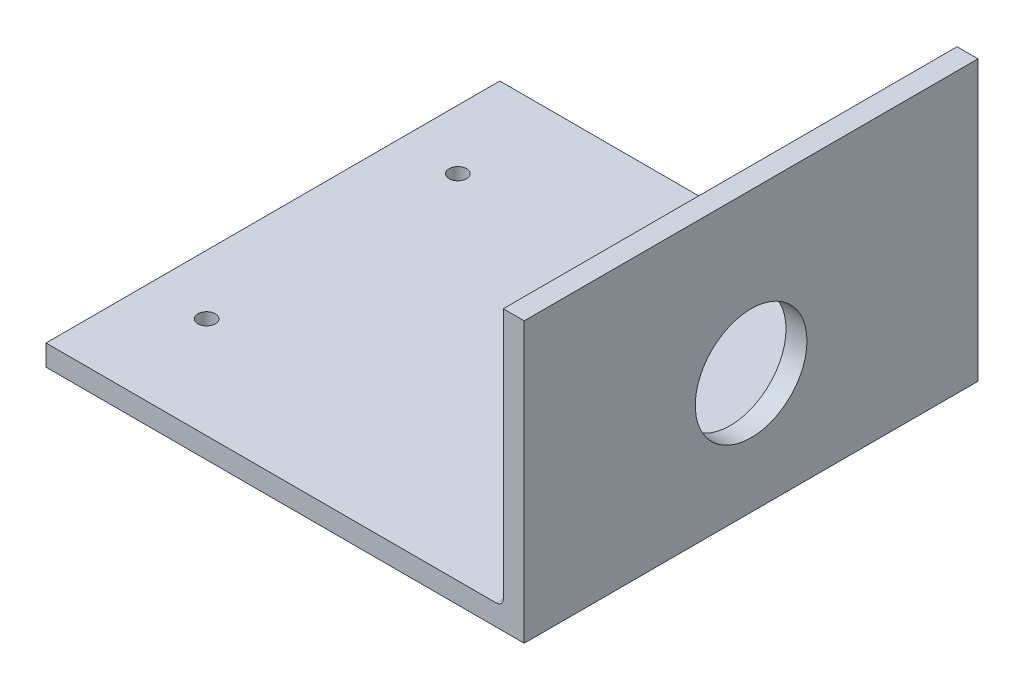
ISO-10303-21;
HEADER;
FILE_DESCRIPTION(('STEP AP214'),'2;1');
FILE_NAME('part.step','',(''),(''),'','','');
FILE_SCHEMA(('AUTOMOTIVE_DESIGN { 1 0 10303 214 1 1 1 1 }'));
ENDSEC;
DATA;
#1=APPLICATION_CONTEXT('core data for automotive mechanical design processes');
#2=APPLICATION_PROTOCOL_DEFINITION('international standard','automotive_design',2000,#1);
#3=PRODUCT_CONTEXT('',#1,'mechanical');
#4=PRODUCT('Part','Part','',(#3));
#5=PRODUCT_RELATED_PRODUCT_CATEGORY('part','',(#4));
#6=PRODUCT_DEFINITION_FORMATION('','',#4);
#7=PRODUCT_DEFINITION_CONTEXT('part definition',#1,'design');
#8=PRODUCT_DEFINITION('design','',#6,#7);
#9=PRODUCT_DEFINITION_SHAPE('','',#8);
#10=(LENGTH_UNIT() NAMED_UNIT(*) SI_UNIT(.MILLI.,.METRE.));
#11=(NAMED_UNIT(*) PLANE_ANGLE_UNIT() SI_UNIT($,.RADIAN.));
#12=(NAMED_UNIT(*) SI_UNIT($,.STERADIAN.) SOLID_ANGLE_UNIT());
#13=UNCERTAINTY_MEASURE_WITH_UNIT(LENGTH_MEASURE(1.E-05),#10,'distance_accuracy_value','');
#14=(GEOMETRIC_REPRESENTATION_CONTEXT(3) GLOBAL_UNCERTAINTY_ASSIGNED_CONTEXT((#13)) GLOBAL_UNIT_ASSIGNED_CONTEXT((#10,
#11,#12)) REPRESENTATION_CONTEXT('',''));
#15=CARTESIAN_POINT('',(0.,0.,0.));
#16=DIRECTION('',(0.,0.,1.));
#17=DIRECTION('',(1.,0.,0.));
#18=AXIS2_PLACEMENT_3D('',#15,#16,#17);
#19=CARTESIAN_POINT('',(0.,860.629465365196,0.));
#20=DIRECTION('',(0.,-1.,0.));
#21=DIRECTION('',(0.,0.,-1.));
#22=AXIS2_PLACEMENT_3D('',#19,#20,#21);
#23=PLANE('',#22);
#24=CARTESIAN_POINT('',(709.231990877992,860.629465365196,1291.3328662841));
#25=DIRECTION('',(0.,-1.,0.));
#26=DIRECTION('',(0.,0.,-1.));
#27=AXIS2_PLACEMENT_3D('',#24,#25,#26);
#28=CIRCLE('',#27,1.24999999999997);
#29=CARTESIAN_POINT('',(709.231990877992,860.629465365196,1290.0828662841));
#30=VERTEX_POINT('',#29);
#31=EDGE_CURVE('E134',#30,#30,#28,.T.);
#32=ORIENTED_EDGE('',*,*,#31,.F.);
#33=EDGE_LOOP('',(#32));
#34=FACE_BOUND('',#33,.T.);
#35=CARTESIAN_POINT('',(661.231990877992,860.629465365196,1327.3328662841));
#36=DIRECTION('',(0.,-1.,0.));
#37=DIRECTION('',(0.,0.,-1.));
#38=AXIS2_PLACEMENT_3D('',#35,#36,#37);
#39=CIRCLE('',#38,1.24999999999997);
#40=CARTESIAN_POINT('',(661.231990877992,860.629465365196,1326.0828662841));
#41=VERTEX_POINT('',#40);
#42=EDGE_CURVE('E146',#41,#41,#39,.T.);
#43=ORIENTED_EDGE('',*,*,#42,.F.);
#44=EDGE_LOOP('',(#43));
#45=FACE_BOUND('',#44,.T.);
#46=DIRECTION('',(1.,0.,0.));
#47=VECTOR('',#46,1.);
#48=CARTESIAN_POINT('',(652.731990877992,860.629465365196,1276.8328662841));
#49=LINE('',#48,#47);
#50=CARTESIAN_POINT('',(652.731990877992,860.629465365196,1276.8328662841));
#51=VERTEX_POINT('',#50);
#52=CARTESIAN_POINT('',(721.231990877992,860.629465365196,1276.8328662841));
#53=VERTEX_POINT('',#52);
#54=EDGE_CURVE('E157',#51,#53,#49,.T.);
#55=ORIENTED_EDGE('',*,*,#54,.T.);
#56=DIRECTION('',(0.,0.,-1.));
#57=VECTOR('',#56,1.);
#58=CARTESIAN_POINT('',(721.231990877992,860.629465365196,1381.98569930993));
#59=LINE('',#58,#57);
#60=CARTESIAN_POINT('',(721.231990877992,860.629465365196,1341.8328662841));
#61=VERTEX_POINT('',#60);
#62=EDGE_CURVE('E122',#61,#53,#59,.T.);
#63=ORIENTED_EDGE('',*,*,#62,.F.);
#64=DIRECTION('',(-1.,0.,0.));
#65=VECTOR('',#64,1.);
#66=CARTESIAN_POINT('',(652.731990877992,860.629465365196,1341.8328662841));
#67=LINE('',#66,#65);
#68=CARTESIAN_POINT('',(652.731990877992,860.629465365196,1341.8328662841));
#69=VERTEX_POINT('',#68);
#70=EDGE_CURVE('E152',#61,#69,#67,.T.);
#71=ORIENTED_EDGE('',*,*,#70,.T.);
#72=DIRECTION('',(0.,0.,-1.));
#73=VECTOR('',#72,1.);
#74=CARTESIAN_POINT('',(652.731990877992,860.629465365196,1341.8328662841));
#75=LINE('',#74,#73);
#76=EDGE_CURVE('E154',#69,#51,#75,.T.);
#77=ORIENTED_EDGE('',*,*,#76,.T.);
#78=EDGE_LOOP('',(#55,#63,#71,#77));
#79=FACE_BOUND('',#78,.T.);
#80=CARTESIAN_POINT('',(661.231990877992,860.629465365196,1291.3328662841));
#81=DIRECTION('',(0.,-1.,0.));
#82=DIRECTION('',(0.,0.,-1.));
#83=AXIS2_PLACEMENT_3D('',#80,#81,#82);
#84=CIRCLE('',#83,1.24999999999997);
#85=CARTESIAN_POINT('',(661.231990877992,860.629465365196,1290.0828662841));
#86=VERTEX_POINT('',#85);
#87=EDGE_CURVE('E140',#86,#86,#84,.T.);
#88=ORIENTED_EDGE('',*,*,#87,.F.);
#89=EDGE_LOOP('',(#88));
#90=FACE_BOUND('',#89,.T.);
#91=CARTESIAN_POINT('',(709.231990877992,860.629465365196,1327.3328662841));
#92=DIRECTION('',(0.,-1.,0.));
#93=DIRECTION('',(0.,0.,-1.));
#94=AXIS2_PLACEMENT_3D('',#91,#92,#93);
#95=CIRCLE('',#94,1.24999999999997);
#96=CARTESIAN_POINT('',(709.231990877992,860.629465365196,1326.0828662841));
#97=VERTEX_POINT('',#96);
#98=EDGE_CURVE('E126',#97,#97,#95,.T.);
#99=ORIENTED_EDGE('',*,*,#98,.F.);
#100=EDGE_LOOP('',(#99));
#101=FACE_BOUND('',#100,.T.);
#102=ADVANCED_FACE('F42',(#34,#45,#79,#90,#101),#23,.T.);
#103=CARTESIAN_POINT('',(0.,863.629465365196,0.));
#104=DIRECTION('',(0.,-1.,0.));
#105=DIRECTION('',(0.,0.,-1.));
#106=AXIS2_PLACEMENT_3D('',#103,#104,#105);
#107=PLANE('',#106);
#108=DIRECTION('',(-1.,0.,0.));
#109=VECTOR('',#108,1.);
#110=CARTESIAN_POINT('',(652.731990877992,863.629465365196,1341.8328662841));
#111=LINE('',#110,#109);
#112=CARTESIAN_POINT('',(717.231990877992,863.629465365196,1341.8328662841));
#113=VERTEX_POINT('',#112);
#114=CARTESIAN_POINT('',(652.731990877992,863.629465365196,1341.8328662841));
#115=VERTEX_POINT('',#114);
#116=EDGE_CURVE('E149',#113,#115,#111,.T.);
#117=ORIENTED_EDGE('',*,*,#116,.F.);
#118=DIRECTION('',(0.,0.,-1.));
#119=VECTOR('',#118,1.);
#120=CARTESIAN_POINT('',(717.231990877992,863.629465365196,0.));
#121=LINE('',#120,#119);
#122=CARTESIAN_POINT('',(717.231990877992,863.629465365196,1276.8328662841));
#123=VERTEX_POINT('',#122);
#124=EDGE_CURVE('E169',#113,#123,#121,.T.);
#125=ORIENTED_EDGE('',*,*,#124,.T.);
#126=DIRECTION('',(1.,0.,0.));
#127=VECTOR('',#126,1.);
#128=CARTESIAN_POINT('',(652.731990877992,863.629465365196,1276.8328662841));
#129=LINE('',#128,#127);
#130=CARTESIAN_POINT('',(652.731990877992,863.629465365196,1276.8328662841));
#131=VERTEX_POINT('',#130);
#132=EDGE_CURVE('E155',#131,#123,#129,.T.);
#133=ORIENTED_EDGE('',*,*,#132,.F.);
#134=DIRECTION('',(0.,0.,-1.));
#135=VECTOR('',#134,1.);
#136=CARTESIAN_POINT('',(652.731990877992,863.629465365196,1341.8328662841));
#137=LINE('',#136,#135);
#138=EDGE_CURVE('E161',#115,#131,#137,.T.);
#139=ORIENTED_EDGE('',*,*,#138,.F.);
#140=EDGE_LOOP('',(#117,#125,#133,#139));
#141=FACE_BOUND('',#140,.T.);
#142=CARTESIAN_POINT('',(661.231990877992,863.629465365196,1327.3328662841));
#143=DIRECTION('',(0.,-1.,0.));
#144=DIRECTION('',(0.,0.,-1.));
#145=AXIS2_PLACEMENT_3D('',#142,#143,#144);
#146=CIRCLE('',#145,1.24999999999997);
#147=CARTESIAN_POINT('',(661.231990877992,863.629465365196,1326.0828662841));
#148=VERTEX_POINT('',#147);
#149=EDGE_CURVE('E143',#148,#148,#146,.T.);
#150=ORIENTED_EDGE('',*,*,#149,.T.);
#151=EDGE_LOOP('',(#150));
#152=FACE_BOUND('',#151,.T.);
#153=CARTESIAN_POINT('',(661.231990877992,863.629465365196,1291.3328662841));
#154=DIRECTION('',(0.,-1.,0.));
#155=DIRECTION('',(0.,0.,-1.));
#156=AXIS2_PLACEMENT_3D('',#153,#154,#155);
#157=CIRCLE('',#156,1.24999999999997);
#158=CARTESIAN_POINT('',(661.231990877992,863.629465365196,1290.0828662841));
#159=VERTEX_POINT('',#158);
#160=EDGE_CURVE('E137',#159,#159,#157,.T.);
#161=ORIENTED_EDGE('',*,*,#160,.T.);
#162=EDGE_LOOP('',(#161));
#163=FACE_BOUND('',#162,.T.);
#164=CARTESIAN_POINT('',(709.231990877992,863.629465365196,1291.3328662841));
#165=DIRECTION('',(0.,-1.,0.));
#166=DIRECTION('',(0.,0.,-1.));
#167=AXIS2_PLACEMENT_3D('',#164,#165,#166);
#168=CIRCLE('',#167,1.24999999999997);
#169=CARTESIAN_POINT('',(709.231990877992,863.629465365196,1290.0828662841));
#170=VERTEX_POINT('',#169);
#171=EDGE_CURVE('E129',#170,#170,#168,.T.);
#172=ORIENTED_EDGE('',*,*,#171,.T.);
#173=EDGE_LOOP('',(#172));
#174=FACE_BOUND('',#173,.T.);
#175=CARTESIAN_POINT('',(709.231990877992,863.629465365196,1327.3328662841));
#176=DIRECTION('',(0.,-1.,0.));
#177=DIRECTION('',(0.,0.,-1.));
#178=AXIS2_PLACEMENT_3D('',#175,#176,#177);
#179=CIRCLE('',#178,1.24999999999997);
#180=CARTESIAN_POINT('',(709.231990877992,863.629465365196,1326.0828662841));
#181=VERTEX_POINT('',#180);
#182=EDGE_CURVE('E130',#181,#181,#179,.T.);
#183=ORIENTED_EDGE('',*,*,#182,.T.);
#184=EDGE_LOOP('',(#183));
#185=FACE_BOUND('',#184,.T.);
#186=ADVANCED_FACE('F176',(#141,#152,#163,#174,#185),#107,.F.);
#187=CARTESIAN_POINT('',(652.731990877992,860.629465365196,1341.8328662841));
#188=DIRECTION('',(0.,0.,-1.));
#189=DIRECTION('',(-1.,0.,0.));
#190=AXIS2_PLACEMENT_3D('',#187,#188,#189);
#191=PLANE('',#190);
#192=DIRECTION('',(0.,-1.,0.));
#193=VECTOR('',#192,1.);
#194=CARTESIAN_POINT('',(718.231990877992,863.629465365196,1341.8328662841));
#195=LINE('',#194,#193);
#196=CARTESIAN_POINT('',(718.231990877992,900.629465365196,1341.8328662841));
#197=VERTEX_POINT('',#196);
#198=CARTESIAN_POINT('',(718.231990877992,864.629465365196,1341.8328662841));
#199=VERTEX_POINT('',#198);
#200=EDGE_CURVE('E110',#197,#199,#195,.T.);
#201=ORIENTED_EDGE('',*,*,#200,.T.);
#202=CARTESIAN_POINT('',(717.231990877992,864.629465365196,1341.8328662841));
#203=DIRECTION('',(0.,0.,-1.));
#204=DIRECTION('',(-1.,0.,0.));
#205=AXIS2_PLACEMENT_3D('',#202,#203,#204);
#206=CIRCLE('',#205,1.);
#207=EDGE_CURVE('E11',#199,#113,#206,.T.);
#208=ORIENTED_EDGE('',*,*,#207,.T.);
#209=ORIENTED_EDGE('',*,*,#116,.T.);
#210=DIRECTION('',(0.,1.,0.));
#211=VECTOR('',#210,1.);
#212=CARTESIAN_POINT('',(652.731990877992,860.629465365196,1341.8328662841));
#213=LINE('',#212,#211);
#214=EDGE_CURVE('E166',#69,#115,#213,.T.);
#215=ORIENTED_EDGE('',*,*,#214,.F.);
#216=ORIENTED_EDGE('',*,*,#70,.F.);
#217=DIRECTION('',(0.,1.,0.));
#218=VECTOR('',#217,1.);
#219=CARTESIAN_POINT('',(721.231990877992,900.629465365196,1341.8328662841));
#220=LINE('',#219,#218);
#221=CARTESIAN_POINT('',(721.231990877992,900.629465365196,1341.8328662841));
#222=VERTEX_POINT('',#221);
#223=EDGE_CURVE('E133',#61,#222,#220,.T.);
#224=ORIENTED_EDGE('',*,*,#223,.T.);
#225=DIRECTION('',(-1.,0.,0.));
#226=VECTOR('',#225,1.);
#227=CARTESIAN_POINT('',(718.231990877992,900.629465365196,1341.8328662841));
#228=LINE('',#227,#226);
#229=EDGE_CURVE('E297',#222,#197,#228,.T.);
#230=ORIENTED_EDGE('',*,*,#229,.T.);
#231=EDGE_LOOP('',(#201,#208,#209,#215,#216,#224,#230));
#232=FACE_BOUND('',#231,.T.);
#233=ADVANCED_FACE('F188',(#232),#191,.F.);
#234=CARTESIAN_POINT('',(652.731990877992,860.629465365196,1341.8328662841));
#235=DIRECTION('',(1.,0.,0.));
#236=DIRECTION('',(0.,0.,-1.));
#237=AXIS2_PLACEMENT_3D('',#234,#235,#236);
#238=PLANE('',#237);
#239=ORIENTED_EDGE('',*,*,#138,.T.);
#240=DIRECTION('',(0.,1.,0.));
#241=VECTOR('',#240,1.);
#242=CARTESIAN_POINT('',(652.731990877992,860.629465365196,1276.8328662841));
#243=LINE('',#242,#241);
#244=EDGE_CURVE('E159',#51,#131,#243,.T.);
#245=ORIENTED_EDGE('',*,*,#244,.F.);
#246=ORIENTED_EDGE('',*,*,#76,.F.);
#247=ORIENTED_EDGE('',*,*,#214,.T.);
#248=EDGE_LOOP('',(#239,#245,#246,#247));
#249=FACE_BOUND('',#248,.T.);
#250=ADVANCED_FACE('F185',(#249),#238,.F.);
#251=CARTESIAN_POINT('',(652.731990877992,860.629465365196,1276.8328662841));
#252=DIRECTION('',(0.,0.,1.));
#253=DIRECTION('',(1.,0.,0.));
#254=AXIS2_PLACEMENT_3D('',#251,#252,#253);
#255=PLANE('',#254);
#256=ORIENTED_EDGE('',*,*,#132,.T.);
#257=CARTESIAN_POINT('',(717.231990877992,864.629465365196,1276.8328662841));
#258=DIRECTION('',(0.,0.,1.));
#259=DIRECTION('',(1.,0.,0.));
#260=AXIS2_PLACEMENT_3D('',#257,#258,#259);
#261=CIRCLE('',#260,1.);
#262=CARTESIAN_POINT('',(718.231990877992,864.629465365196,1276.8328662841));
#263=VERTEX_POINT('',#262);
#264=EDGE_CURVE('E50',#123,#263,#261,.T.);
#265=ORIENTED_EDGE('',*,*,#264,.T.);
#266=DIRECTION('',(0.,1.,0.));
#267=VECTOR('',#266,1.);
#268=CARTESIAN_POINT('',(718.231990877992,863.629465365196,1276.8328662841));
#269=LINE('',#268,#267);
#270=CARTESIAN_POINT('',(718.231990877992,900.629465365196,1276.8328662841));
#271=VERTEX_POINT('',#270);
#272=EDGE_CURVE('E98',#263,#271,#269,.T.);
#273=ORIENTED_EDGE('',*,*,#272,.T.);
#274=DIRECTION('',(1.,0.,0.));
#275=VECTOR('',#274,1.);
#276=CARTESIAN_POINT('',(718.231990877992,900.629465365196,1276.8328662841));
#277=LINE('',#276,#275);
#278=CARTESIAN_POINT('',(721.231990877992,900.629465365196,1276.8328662841));
#279=VERTEX_POINT('',#278);
#280=EDGE_CURVE('E103',#271,#279,#277,.T.);
#281=ORIENTED_EDGE('',*,*,#280,.T.);
#282=DIRECTION('',(0.,-1.,0.));
#283=VECTOR('',#282,1.);
#284=CARTESIAN_POINT('',(721.231990877992,900.629465365196,1276.8328662841));
#285=LINE('',#284,#283);
#286=EDGE_CURVE('E114',#279,#53,#285,.T.);
#287=ORIENTED_EDGE('',*,*,#286,.T.);
#288=ORIENTED_EDGE('',*,*,#54,.F.);
#289=ORIENTED_EDGE('',*,*,#244,.T.);
#290=EDGE_LOOP('',(#256,#265,#273,#281,#287,#288,#289));
#291=FACE_BOUND('',#290,.T.);
#292=ADVANCED_FACE('F100',(#291),#255,.F.);
#293=CARTESIAN_POINT('',(661.231990877992,860.629465365196,1327.3328662841));
#294=DIRECTION('',(0.,1.,0.));
#295=DIRECTION('',(0.,0.,1.));
#296=AXIS2_PLACEMENT_3D('',#293,#294,#295);
#297=CYLINDRICAL_SURFACE('',#296,1.24999999999997);
#298=ORIENTED_EDGE('',*,*,#149,.F.);
#299=EDGE_LOOP('',(#298));
#300=FACE_BOUND('',#299,.T.);
#301=ORIENTED_EDGE('',*,*,#42,.T.);
#302=EDGE_LOOP('',(#301));
#303=FACE_BOUND('',#302,.T.);
#304=ADVANCED_FACE('F210',(#300,#303),#297,.F.);
#305=CARTESIAN_POINT('',(661.231990877992,860.629465365196,1291.3328662841));
#306=DIRECTION('',(0.,1.,0.));
#307=DIRECTION('',(0.,0.,1.));
#308=AXIS2_PLACEMENT_3D('',#305,#306,#307);
#309=CYLINDRICAL_SURFACE('',#308,1.24999999999997);
#310=ORIENTED_EDGE('',*,*,#160,.F.);
#311=EDGE_LOOP('',(#310));
#312=FACE_BOUND('',#311,.T.);
#313=ORIENTED_EDGE('',*,*,#87,.T.);
#314=EDGE_LOOP('',(#313));
#315=FACE_BOUND('',#314,.T.);
#316=ADVANCED_FACE('F268',(#312,#315),#309,.F.);
#317=CARTESIAN_POINT('',(709.231990877992,860.629465365196,1291.3328662841));
#318=DIRECTION('',(0.,1.,0.));
#319=DIRECTION('',(0.,0.,1.));
#320=AXIS2_PLACEMENT_3D('',#317,#318,#319);
#321=CYLINDRICAL_SURFACE('',#320,1.24999999999997);
#322=ORIENTED_EDGE('',*,*,#171,.F.);
#323=EDGE_LOOP('',(#322));
#324=FACE_BOUND('',#323,.T.);
#325=ORIENTED_EDGE('',*,*,#31,.T.);
#326=EDGE_LOOP('',(#325));
#327=FACE_BOUND('',#326,.T.);
#328=ADVANCED_FACE('F265',(#324,#327),#321,.F.);
#329=CARTESIAN_POINT('',(709.231990877992,860.629465365196,1327.3328662841));
#330=DIRECTION('',(0.,1.,0.));
#331=DIRECTION('',(0.,0.,1.));
#332=AXIS2_PLACEMENT_3D('',#329,#330,#331);
#333=CYLINDRICAL_SURFACE('',#332,1.24999999999997);
#334=ORIENTED_EDGE('',*,*,#182,.F.);
#335=EDGE_LOOP('',(#334));
#336=FACE_BOUND('',#335,.T.);
#337=ORIENTED_EDGE('',*,*,#98,.T.);
#338=EDGE_LOOP('',(#337));
#339=FACE_BOUND('',#338,.T.);
#340=ADVANCED_FACE('F255',(#336,#339),#333,.F.);
#341=CARTESIAN_POINT('',(721.231990877992,900.629465365196,1381.98569930993));
#342=DIRECTION('',(1.,0.,0.));
#343=DIRECTION('',(0.,0.,-1.));
#344=AXIS2_PLACEMENT_3D('',#341,#342,#343);
#345=PLANE('',#344);
#346=CARTESIAN_POINT('',(721.231990877992,877.879465365196,1309.3328662841));
#347=DIRECTION('',(1.,0.,0.));
#348=DIRECTION('',(0.,0.,-1.));
#349=AXIS2_PLACEMENT_3D('',#346,#347,#348);
#350=CIRCLE('',#349,7.99999999999999);
#351=CARTESIAN_POINT('',(721.231990877992,877.879465365196,1301.3328662841));
#352=VERTEX_POINT('',#351);
#353=EDGE_CURVE('E105',#352,#352,#350,.T.);
#354=ORIENTED_EDGE('',*,*,#353,.F.);
#355=EDGE_LOOP('',(#354));
#356=FACE_BOUND('',#355,.T.);
#357=ORIENTED_EDGE('',*,*,#223,.F.);
#358=ORIENTED_EDGE('',*,*,#62,.T.);
#359=ORIENTED_EDGE('',*,*,#286,.F.);
#360=DIRECTION('',(0.,0.,-1.));
#361=VECTOR('',#360,1.);
#362=CARTESIAN_POINT('',(721.231990877992,900.629465365196,1381.98569930993));
#363=LINE('',#362,#361);
#364=EDGE_CURVE('E113',#222,#279,#363,.T.);
#365=ORIENTED_EDGE('',*,*,#364,.F.);
#366=EDGE_LOOP('',(#357,#358,#359,#365));
#367=FACE_BOUND('',#366,.T.);
#368=ADVANCED_FACE('F253',(#356,#367),#345,.T.);
#369=CARTESIAN_POINT('',(718.231990877992,900.629465365196,1381.98569930993));
#370=DIRECTION('',(0.,1.,0.));
#371=DIRECTION('',(0.,0.,1.));
#372=AXIS2_PLACEMENT_3D('',#369,#370,#371);
#373=PLANE('',#372);
#374=ORIENTED_EDGE('',*,*,#229,.F.);
#375=ORIENTED_EDGE('',*,*,#364,.T.);
#376=ORIENTED_EDGE('',*,*,#280,.F.);
#377=DIRECTION('',(0.,0.,-1.));
#378=VECTOR('',#377,1.);
#379=CARTESIAN_POINT('',(718.231990877992,900.629465365196,1381.98569930993));
#380=LINE('',#379,#378);
#381=EDGE_CURVE('E108',#197,#271,#380,.T.);
#382=ORIENTED_EDGE('',*,*,#381,.F.);
#383=EDGE_LOOP('',(#374,#375,#376,#382));
#384=FACE_BOUND('',#383,.T.);
#385=ADVANCED_FACE('F116',(#384),#373,.T.);
#386=CARTESIAN_POINT('',(718.231990877992,863.629465365196,1381.98569930993));
#387=DIRECTION('',(-1.,0.,0.));
#388=DIRECTION('',(0.,0.,1.));
#389=AXIS2_PLACEMENT_3D('',#386,#387,#388);
#390=PLANE('',#389);
#391=CARTESIAN_POINT('',(718.231990877992,877.879465365196,1309.3328662841));
#392=DIRECTION('',(-1.,0.,0.));
#393=DIRECTION('',(0.,0.,1.));
#394=AXIS2_PLACEMENT_3D('',#391,#392,#393);
#395=CIRCLE('',#394,7.99999999999999);
#396=CARTESIAN_POINT('',(718.231990877992,877.879465365196,1317.3328662841));
#397=VERTEX_POINT('',#396);
#398=EDGE_CURVE('E301',#397,#397,#395,.F.);
#399=ORIENTED_EDGE('',*,*,#398,.T.);
#400=EDGE_LOOP('',(#399));
#401=FACE_BOUND('',#400,.T.);
#402=ORIENTED_EDGE('',*,*,#272,.F.);
#403=DIRECTION('',(0.,0.,-1.));
#404=VECTOR('',#403,1.);
#405=CARTESIAN_POINT('',(718.231990877992,864.629465365196,1381.98569930993));
#406=LINE('',#405,#404);
#407=EDGE_CURVE('E63',#263,#199,#406,.F.);
#408=ORIENTED_EDGE('',*,*,#407,.T.);
#409=ORIENTED_EDGE('',*,*,#200,.F.);
#410=ORIENTED_EDGE('',*,*,#381,.T.);
#411=EDGE_LOOP('',(#402,#408,#409,#410));
#412=FACE_BOUND('',#411,.T.);
#413=ADVANCED_FACE('F109',(#401,#412),#390,.T.);
#414=CARTESIAN_POINT('',(652.730990877992,877.879465365196,1309.3328662841));
#415=DIRECTION('',(1.,0.,0.));
#416=DIRECTION('',(0.,0.,-1.));
#417=AXIS2_PLACEMENT_3D('',#414,#415,#416);
#418=CYLINDRICAL_SURFACE('',#417,7.99999999999999);
#419=ORIENTED_EDGE('',*,*,#398,.F.);
#420=EDGE_LOOP('',(#419));
#421=FACE_BOUND('',#420,.T.);
#422=ORIENTED_EDGE('',*,*,#353,.T.);
#423=EDGE_LOOP('',(#422));
#424=FACE_BOUND('',#423,.T.);
#425=ADVANCED_FACE('F191',(#421,#424),#418,.F.);
#426=CARTESIAN_POINT('',(717.231990877992,864.629465365196,0.));
#427=DIRECTION('',(0.,0.,-1.));
#428=DIRECTION('',(-1.,0.,0.));
#429=AXIS2_PLACEMENT_3D('',#426,#427,#428);
#430=CYLINDRICAL_SURFACE('',#429,1.);
#431=ORIENTED_EDGE('',*,*,#207,.F.);
#432=ORIENTED_EDGE('',*,*,#407,.F.);
#433=ORIENTED_EDGE('',*,*,#264,.F.);
#434=ORIENTED_EDGE('',*,*,#124,.F.);
#435=EDGE_LOOP('',(#431,#432,#433,#434));
#436=FACE_BOUND('',#435,.T.);
#437=ADVANCED_FACE('F44',(#436),#430,.F.);
#438=CLOSED_SHELL('',(#102,#186,#233,#250,#292,#304,#316,#328,#340,#368,#385,#413,#425,#437));
#439=MANIFOLD_SOLID_BREP('B2',#438);
#440=ADVANCED_BREP_SHAPE_REPRESENTATION('',(#18,#439),#14);
#441=SHAPE_DEFINITION_REPRESENTATION(#9,#440);
ENDSEC;
END-ISO-10303-21;
